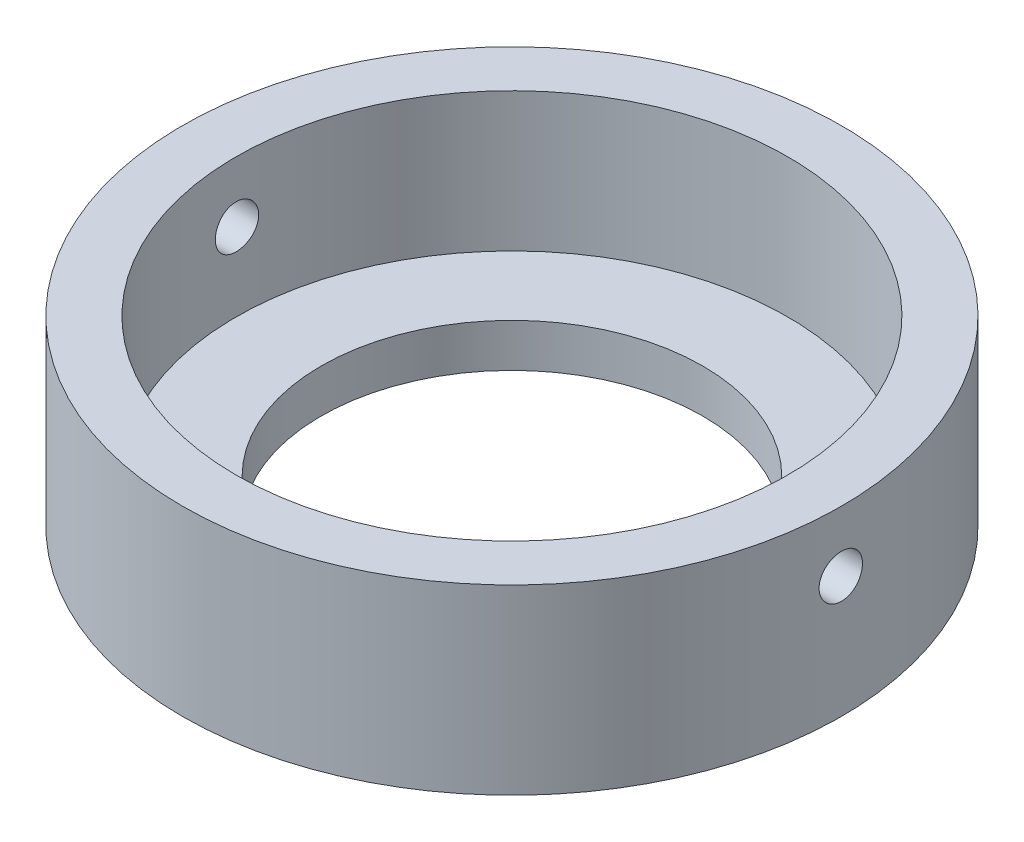
ISO-10303-21;
HEADER;
FILE_DESCRIPTION(('STEP AP214'),'2;1');
FILE_NAME('part.step','',(''),(''),'','','');
FILE_SCHEMA(('AUTOMOTIVE_DESIGN { 1 0 10303 214 1 1 1 1 }'));
ENDSEC;
DATA;
#1=APPLICATION_CONTEXT('core data for automotive mechanical design processes');
#2=APPLICATION_PROTOCOL_DEFINITION('international standard','automotive_design',2000,#1);
#3=PRODUCT_CONTEXT('',#1,'mechanical');
#4=PRODUCT('Part','Part','',(#3));
#5=PRODUCT_RELATED_PRODUCT_CATEGORY('part','',(#4));
#6=PRODUCT_DEFINITION_FORMATION('','',#4);
#7=PRODUCT_DEFINITION_CONTEXT('part definition',#1,'design');
#8=PRODUCT_DEFINITION('design','',#6,#7);
#9=PRODUCT_DEFINITION_SHAPE('','',#8);
#10=(LENGTH_UNIT() NAMED_UNIT(*) SI_UNIT(.MILLI.,.METRE.));
#11=(NAMED_UNIT(*) PLANE_ANGLE_UNIT() SI_UNIT($,.RADIAN.));
#12=(NAMED_UNIT(*) SI_UNIT($,.STERADIAN.) SOLID_ANGLE_UNIT());
#13=UNCERTAINTY_MEASURE_WITH_UNIT(LENGTH_MEASURE(1.E-05),#10,'distance_accuracy_value','');
#14=(GEOMETRIC_REPRESENTATION_CONTEXT(3) GLOBAL_UNCERTAINTY_ASSIGNED_CONTEXT((#13)) GLOBAL_UNIT_ASSIGNED_CONTEXT((#10,
#11,#12)) REPRESENTATION_CONTEXT('',''));
#15=CARTESIAN_POINT('',(0.,0.,0.));
#16=DIRECTION('',(0.,0.,1.));
#17=DIRECTION('',(1.,0.,0.));
#18=AXIS2_PLACEMENT_3D('',#15,#16,#17);
#19=CARTESIAN_POINT('',(0.,2.5,0.));
#20=DIRECTION('',(0.,-1.,0.));
#21=DIRECTION('',(0.,0.,-1.));
#22=AXIS2_PLACEMENT_3D('',#19,#20,#21);
#23=CYLINDRICAL_SURFACE('',#22,19.);
#24=CARTESIAN_POINT('',(18.9588369896468,7.,1.24999999999999));
#25=CARTESIAN_POINT('',(18.9588375396088,7.07013148410964,1.24999691698055));
#26=CARTESIAN_POINT('',(18.9592303148243,7.14031188548215,1.24407805299881));
#27=CARTESIAN_POINT('',(18.9607591328196,7.27873428538638,1.22055180266377));
#28=CARTESIAN_POINT('',(18.9618960375227,7.34697394019588,1.20293086147641));
#29=CARTESIAN_POINT('',(18.9647837839129,7.4794897783657,1.1565092682008));
#30=CARTESIAN_POINT('',(18.9665342981522,7.54376805421409,1.12771457801599));
#31=CARTESIAN_POINT('',(18.9704516079821,7.66656232997985,1.05977264730639));
#32=CARTESIAN_POINT('',(18.9726183091025,7.72507963302704,1.02062775541117));
#33=CARTESIAN_POINT('',(18.9771278975969,7.83480407260864,0.9330259586646));
#34=CARTESIAN_POINT('',(18.9794710371753,7.88600042957064,0.884555563854293));
#35=CARTESIAN_POINT('',(18.984067145466,7.97953738585654,0.779706632804727));
#36=CARTESIAN_POINT('',(18.9863201103897,8.02187761340709,0.723327764739887));
#37=CARTESIAN_POINT('',(18.9904842240195,8.09653392936496,0.604200969092946));
#38=CARTESIAN_POINT('',(18.9923950661852,8.1288410469995,0.541447407929066));
#39=CARTESIAN_POINT('',(18.9956569629665,8.18245663362515,0.411392049451877));
#40=CARTESIAN_POINT('',(18.9970080241015,8.20376523070846,0.344090305118453));
#41=CARTESIAN_POINT('',(18.998996383403,8.23474885133426,0.206953324972158));
#42=CARTESIAN_POINT('',(18.9996347217425,8.24444083010752,0.137121935206072));
#43=CARTESIAN_POINT('',(19.0001292164116,8.25196846233493,-0.00317924369410461));
#44=CARTESIAN_POINT('',(18.999985382355,8.24980426151516,-0.073649024971002));
#45=CARTESIAN_POINT('',(18.9989326057468,8.23369493743142,-0.213111746980413));
#46=CARTESIAN_POINT('',(18.9980248476562,8.21976805204224,-0.282106804548809));
#47=CARTESIAN_POINT('',(18.9955477714651,8.18055700174089,-0.416777761157239));
#48=CARTESIAN_POINT('',(18.9939784491166,8.15527276390538,-0.48245363888246));
#49=CARTESIAN_POINT('',(18.9903528796175,8.09404412894595,-0.608680412720544));
#50=CARTESIAN_POINT('',(18.98829625581,8.05809148028618,-0.669227295016875));
#51=CARTESIAN_POINT('',(18.9839274937888,7.97655258861317,-0.783433543890819));
#52=CARTESIAN_POINT('',(18.9816153523789,7.93096622508746,-0.837092824294812));
#53=CARTESIAN_POINT('',(18.9769905476197,7.83135095910624,-0.936107153052133));
#54=CARTESIAN_POINT('',(18.9746778915818,7.77730622437404,-0.981446274902408));
#55=CARTESIAN_POINT('',(18.970317163269,7.6623637752548,-1.06241044516599));
#56=CARTESIAN_POINT('',(18.9682690911121,7.60146605781396,-1.0980354892505));
#57=CARTESIAN_POINT('',(18.964668845539,7.4745360356885,-1.15855917855933));
#58=CARTESIAN_POINT('',(18.9631167041369,7.40850339986849,-1.18345713134759));
#59=CARTESIAN_POINT('',(18.9606844759929,7.27318270284996,-1.22180877024509));
#60=CARTESIAN_POINT('',(18.9598043804859,7.20389468412224,-1.23526260561433));
#61=CARTESIAN_POINT('',(18.9588171416418,7.06416903948202,-1.25032421791206));
#62=CARTESIAN_POINT('',(18.9587085531268,6.99373381081816,-1.25195414337159));
#63=CARTESIAN_POINT('',(18.9592727977804,6.85359097983464,-1.24337955784981));
#64=CARTESIAN_POINT('',(18.9599456264371,6.78388337331601,-1.23317511520025));
#65=CARTESIAN_POINT('',(18.9619955645894,6.64723729481512,-1.20123986779917));
#66=CARTESIAN_POINT('',(18.963372049623,6.58029642432118,-1.17951928244908));
#67=CARTESIAN_POINT('',(18.9666736573975,6.45100995516739,-1.12517867380962));
#68=CARTESIAN_POINT('',(18.9685987856506,6.38866440268511,-1.09255854101074));
#69=CARTESIAN_POINT('',(18.9727842462309,6.27023664657834,-1.01728828167363));
#70=CARTESIAN_POINT('',(18.9750450723162,6.21416388592539,-0.974623325732559));
#71=CARTESIAN_POINT('',(18.9796454413481,6.1099685822142,-0.880496081652914));
#72=CARTESIAN_POINT('',(18.9819849851459,6.06184612515927,-0.829033698359408));
#73=CARTESIAN_POINT('',(18.9864833988913,5.97484252619028,-0.71867704968889));
#74=CARTESIAN_POINT('',(18.9886419851557,5.93597572487409,-0.659771465254633));
#75=CARTESIAN_POINT('',(18.9925311801518,5.86868489103533,-0.536257375811505));
#76=CARTESIAN_POINT('',(18.9942617917539,5.84026078847091,-0.471648909056937));
#77=CARTESIAN_POINT('',(18.9970986926279,5.7946871087704,-0.338615587581912));
#78=CARTESIAN_POINT('',(18.9982054827766,5.77752848456221,-0.270193843255301));
#79=CARTESIAN_POINT('',(18.9996720348125,5.75494322959253,-0.131433046477445));
#80=CARTESIAN_POINT('',(19.000031804991,5.74951646861575,-0.0610940153154892));
#81=CARTESIAN_POINT('',(18.9999638037838,5.7505502787395,0.0793628308777347));
#82=CARTESIAN_POINT('',(18.9995375183576,5.75698842041219,0.149480812817942));
#83=CARTESIAN_POINT('',(18.9979482842031,5.78152273833978,0.287637803133685));
#84=CARTESIAN_POINT('',(18.996785334213,5.79961893456427,0.355676807947845));
#85=CARTESIAN_POINT('',(18.9938534516233,5.84695051494484,0.487747547886215));
#86=CARTESIAN_POINT('',(18.9920845266476,5.87618575896041,0.551779333413506));
#87=CARTESIAN_POINT('',(18.9881392048471,5.94496254986691,0.674028689025409));
#88=CARTESIAN_POINT('',(18.9859628180138,5.98450384404986,0.732246401624724));
#89=CARTESIAN_POINT('',(18.9814424191099,6.07285351594977,0.841329014255547));
#90=CARTESIAN_POINT('',(18.9790981168421,6.12167819073545,0.892180702337157));
#91=CARTESIAN_POINT('',(18.9745084582332,6.22718521529731,0.984984167349629));
#92=CARTESIAN_POINT('',(18.9722631262104,6.28386948225164,1.02693376647075));
#93=CARTESIAN_POINT('',(18.9681223184561,6.4035575904423,1.10077681645825));
#94=CARTESIAN_POINT('',(18.9662273109671,6.46656971844572,1.13265684810675));
#95=CARTESIAN_POINT('',(18.9630076611085,6.59701928150292,1.18534540776379));
#96=CARTESIAN_POINT('',(18.9616823527565,6.66445144259464,1.20616687006853));
#97=CARTESIAN_POINT('',(18.9600985946234,6.77691181079718,1.23075057711041));
#98=CARTESIAN_POINT('',(18.9596276152415,6.8212135446496,1.23795974025141));
#99=CARTESIAN_POINT('',(18.9589966371749,6.91033685337026,1.24758543358804));
#100=CARTESIAN_POINT('',(18.958836638005,6.95515842742738,1.25000197126071));
#101=CARTESIAN_POINT('',(18.9588369896468,7.,1.24999999999999));
#102=B_SPLINE_CURVE_WITH_KNOTS('',3,(#24,#25,#26,#27,#28,#29,#30,#31,#32,#33,#34,#35,#36,#37,
#38,#39,#40,#41,#42,#43,#44,#45,#46,#47,#48,#49,#50,#51,#52,#53,#54,#55,#56,#57,#58,#59,#60,#61,
#62,#63,#64,#65,#66,#67,#68,#69,#70,#71,#72,#73,#74,#75,#76,#77,#78,#79,#80,#81,#82,#83,#84,#85,
#86,#87,#88,#89,#90,#91,#92,#93,#94,#95,#96,#97,#98,#99,#100,#101),.UNSPECIFIED.,.T.,.F.,(4,2,2,
2,2,2,2,2,2,2,2,2,2,2,2,2,2,2,2,2,2,2,2,2,2,2,2,2,2,2,2,2,2,2,2,2,2,2,4),(0.,0.210230749240217,
0.420705440205018,0.631067983651483,0.841382833311276,1.05200423643321,1.26263447950241,
1.47345251198605,1.68426808916168,1.89477559074736,2.1052805049597,2.31545963219809,
2.52564010897453,2.73598357652074,2.94632967550407,3.15707431337854,3.36781904516507,
3.57857737853193,3.78933296303909,3.9996936583017,4.21005313894565,4.42022625868903,
4.63040149013909,4.84088897562352,5.0513787379314,5.26219253891799,5.47300492589643,
5.68364780605834,5.89428834822283,6.10453110361536,6.31477421914261,6.52501468968572,
6.73525000554354,6.94585785736152,7.15651717310201,7.36745605113516,7.57814766499504,
7.71256792183232,7.84698796895856),.UNSPECIFIED.);
#103=CARTESIAN_POINT('',(18.9588369896468,7.,1.24999999999999));
#104=VERTEX_POINT('',#103);
#105=EDGE_CURVE('E74',#104,#104,#102,.T.);
#106=ORIENTED_EDGE('',*,*,#105,.T.);
#107=EDGE_LOOP('',(#106));
#108=FACE_BOUND('',#107,.T.);
#109=CARTESIAN_POINT('',(-18.9705689319611,5.9420718434515,-1.05712555593429));
#110=CARTESIAN_POINT('',(-18.9677662861485,5.99629419312282,-1.10742192407926));
#111=CARTESIAN_POINT('',(-18.9649856856747,6.05424974257248,-1.15372164064828));
#112=CARTESIAN_POINT('',(-18.9597054284623,6.1762917727867,-1.23747134811881));
#113=CARTESIAN_POINT('',(-18.9572060217674,6.24038361781009,-1.27491349478546));
#114=CARTESIAN_POINT('',(-18.9523418330472,6.38380851707578,-1.34543206744556));
#115=CARTESIAN_POINT('',(-18.950060760891,6.46394945499014,-1.37688323319947));
#116=CARTESIAN_POINT('',(-18.946407466982,6.62831756667747,-1.42627496104311));
#117=CARTESIAN_POINT('',(-18.9450355416123,6.71254606340576,-1.44421111748194));
#118=CARTESIAN_POINT('',(-18.9433280446038,6.88486276047511,-1.46644259220615));
#119=CARTESIAN_POINT('',(-18.9430181798103,6.97299507061716,-1.4703996185725));
#120=CARTESIAN_POINT('',(-18.9435417507761,7.14869138735992,-1.46363798036328));
#121=CARTESIAN_POINT('',(-18.9443752213083,7.23625537659461,-1.45291886943484));
#122=CARTESIAN_POINT('',(-18.9471033256541,7.40906859753269,-1.4168988095983));
#123=CARTESIAN_POINT('',(-18.9490065603693,7.49429311993968,-1.39147962367509));
#124=CARTESIAN_POINT('',(-18.95366169911,7.65918467850104,-1.32655989389024));
#125=CARTESIAN_POINT('',(-18.9564135985352,7.73885174477815,-1.28705942635961));
#126=CARTESIAN_POINT('',(-18.9624083110717,7.8893248717607,-1.19546860954792));
#127=CARTESIAN_POINT('',(-18.9656451423692,7.96022194733279,-1.14352759475739));
#128=CARTESIAN_POINT('',(-18.972249627804,8.09194148228924,-1.02814006320633));
#129=CARTESIAN_POINT('',(-18.9756172615079,8.15276550748841,-0.964695337868967));
#130=CARTESIAN_POINT('',(-18.9819747960724,8.26061528303371,-0.830077588310768));
#131=CARTESIAN_POINT('',(-18.9849729686818,8.3079985472216,-0.759191593005473));
#132=CARTESIAN_POINT('',(-18.9903446765614,8.38964803874912,-0.610205994967871));
#133=CARTESIAN_POINT('',(-18.9927183687512,8.42391756230036,-0.532108211093196));
#134=CARTESIAN_POINT('',(-18.996473868298,8.47701625637805,-0.374138356340968));
#135=CARTESIAN_POINT('',(-18.9978901916986,8.49638666202069,-0.29444888578762));
#136=CARTESIAN_POINT('',(-18.9997065671621,8.5210966356126,-0.132915776110982));
#137=CARTESIAN_POINT('',(-19.0001068096528,8.52643883265223,-0.0510725435384695));
#138=CARTESIAN_POINT('',(-18.9998474013877,8.52294485683122,0.110102157462776));
#139=CARTESIAN_POINT('',(-18.9992158853331,8.5144850551604,0.189442127310822));
#140=CARTESIAN_POINT('',(-18.9970177045635,8.48439908761366,0.34556533288149));
#141=CARTESIAN_POINT('',(-18.9954510646597,8.46277327106536,0.422348636381924));
#142=CARTESIAN_POINT('',(-18.9915558362146,8.4070880838567,0.571284456042974));
#143=CARTESIAN_POINT('',(-18.989226806353,8.3730215103632,0.643434261031799));
#144=CARTESIAN_POINT('',(-18.9840594564712,8.29357358859691,0.781181618972696));
#145=CARTESIAN_POINT('',(-18.9812210803858,8.24819099452064,0.846778449380168));
#146=CARTESIAN_POINT('',(-18.9752538090447,8.14615206413419,0.971467135948675));
#147=CARTESIAN_POINT('',(-18.9721191877792,8.08922754279029,1.03033907834171));
#148=CARTESIAN_POINT('',(-18.9659599443625,7.96660930180564,1.13810547232384));
#149=CARTESIAN_POINT('',(-18.9629353415514,7.90091404976447,1.18699817658157));
#150=CARTESIAN_POINT('',(-18.9572030208753,7.75999572016471,1.27534008311509));
#151=CARTESIAN_POINT('',(-18.9545113011066,7.6845089103943,1.31436973826795));
#152=CARTESIAN_POINT('',(-18.9498714881824,7.52817913579579,1.37965427223562));
#153=CARTESIAN_POINT('',(-18.9479235166329,7.44733529760507,1.40590706217253));
#154=CARTESIAN_POINT('',(-18.9449321895507,7.27993299630997,1.44566918938653));
#155=CARTESIAN_POINT('',(-18.9439183365141,7.19327536668519,1.45876403358614));
#156=CARTESIAN_POINT('',(-18.9430120165431,7.01897794862135,1.47048645574347));
#157=CARTESIAN_POINT('',(-18.9431196667616,6.93133805852998,1.46911252228368));
#158=CARTESIAN_POINT('',(-18.9444542089947,6.75625845094541,1.45180271502945));
#159=CARTESIAN_POINT('',(-18.9456968913864,6.66883905256669,1.43566139457929));
#160=CARTESIAN_POINT('',(-18.9491824608535,6.49797698615774,1.38889501058114));
#161=CARTESIAN_POINT('',(-18.9514253663719,6.41453439148662,1.35826967996391));
#162=CARTESIAN_POINT('',(-18.9566384198646,6.25451050542352,1.28345325843521));
#163=CARTESIAN_POINT('',(-18.9596047529666,6.17789601076512,1.23933303004397));
#164=CARTESIAN_POINT('',(-18.9659227927169,6.03341626197766,1.13855687277488));
#165=CARTESIAN_POINT('',(-18.9692744583861,5.965550079111,1.0819022763071));
#166=CARTESIAN_POINT('',(-18.9758756792714,5.84234017881964,0.959073911477655));
#167=CARTESIAN_POINT('',(-18.9791257254322,5.78673055711979,0.893167156626319));
#168=CARTESIAN_POINT('',(-18.9852173322174,5.68787682809751,0.752632409632592));
#169=CARTESIAN_POINT('',(-18.9880589881408,5.64462983358516,0.678006459531128));
#170=CARTESIAN_POINT('',(-18.9928892177543,5.57345086929805,0.525148654074515));
#171=CARTESIAN_POINT('',(-18.9949057529763,5.54500602412726,0.447156489046599));
#172=CARTESIAN_POINT('',(-18.9979938483914,5.5020872555964,0.28740452763545));
#173=CARTESIAN_POINT('',(-18.9990656431229,5.48760986463247,0.205645671666527));
#174=CARTESIAN_POINT('',(-19.0001172631899,5.47340707144413,0.0435641623958573));
#175=CARTESIAN_POINT('',(-19.0001317840648,5.47321294672758,-0.0367175157280901));
#176=CARTESIAN_POINT('',(-18.9991546434706,5.48640603786591,-0.196157983436856));
#177=CARTESIAN_POINT('',(-18.9981629176488,5.49979412234596,-0.275316700876486));
#178=CARTESIAN_POINT('',(-18.995299006671,5.53949488325817,-0.429560107299692));
#179=CARTESIAN_POINT('',(-18.9934345040151,5.5656948727547,-0.504674090640115));
#180=CARTESIAN_POINT('',(-18.9890332129628,5.63007362317762,-0.649512260647918));
#181=CARTESIAN_POINT('',(-18.9864968344493,5.66824508342114,-0.719239700031817));
#182=CARTESIAN_POINT('',(-18.9817033777832,5.74450175640642,-0.835120297419386));
#183=CARTESIAN_POINT('',(-18.9795331116262,5.78025910019073,-0.882830448582407));
#184=CARTESIAN_POINT('',(-18.9750934320603,5.85723021485121,-0.973597285307051));
#185=CARTESIAN_POINT('',(-18.9728240454795,5.89844251533769,-1.01665521921831));
#186=CARTESIAN_POINT('',(-18.9705689319611,5.9420718434515,-1.05712555593429));
#187=B_SPLINE_CURVE_WITH_KNOTS('',3,(#109,#110,#111,#112,#113,#114,#115,#116,#117,#118,#119,
#120,#121,#122,#123,#124,#125,#126,#127,#128,#129,#130,#131,#132,#133,#134,#135,#136,#137,#138,
#139,#140,#141,#142,#143,#144,#145,#146,#147,#148,#149,#150,#151,#152,#153,#154,#155,#156,#157,
#158,#159,#160,#161,#162,#163,#164,#165,#166,#167,#168,#169,#170,#171,#172,#173,#174,#175,#176,
#177,#178,#179,#180,#181,#182,#183,#184,#185,#186),.UNSPECIFIED.,.T.,.F.,(4,2,2,2,2,2,2,2,2,2,2,
2,2,2,2,2,2,2,2,2,2,2,2,2,2,2,2,2,2,2,2,2,2,2,2,2,2,2,4),(0.,0.221867608989586,
0.443930973751528,0.70109091406853,0.958334647695458,1.22176252914999,1.48519842254936,
1.75078327546906,2.01636668874321,2.2789091377999,2.54141073731358,2.79608102928326,
3.05068726634647,3.29553931858209,3.54034547870519,3.77858681841761,4.01682183726082,
4.2551950064319,4.49359443018072,4.73834643242589,4.98314125323631,5.23705346500419,
5.49100717471228,5.7527311841889,6.01448253378954,6.27993172262784,6.5453858062485,
6.80946923314762,7.07352460131268,7.33111519039006,7.58864557206358,7.83653183040895,
8.08435653188841,8.32404481509757,8.5637484280956,8.80138065485581,9.03886824482772,
9.21743924762482,9.39596221406046),.UNSPECIFIED.);
#188=CARTESIAN_POINT('',(-18.9705689319611,5.9420718434515,-1.05712555593429));
#189=VERTEX_POINT('',#188);
#190=EDGE_CURVE('E10',#189,#189,#187,.T.);
#191=ORIENTED_EDGE('',*,*,#190,.T.);
#192=EDGE_LOOP('',(#191));
#193=FACE_BOUND('',#192,.T.);
#194=CARTESIAN_POINT('',(0.,0.,0.));
#195=DIRECTION('',(0.,1.,0.));
#196=DIRECTION('',(0.,0.,1.));
#197=AXIS2_PLACEMENT_3D('',#194,#195,#196);
#198=CIRCLE('',#197,19.);
#199=CARTESIAN_POINT('',(0.,0.,19.));
#200=VERTEX_POINT('',#199);
#201=EDGE_CURVE('E65',#200,#200,#198,.T.);
#202=ORIENTED_EDGE('',*,*,#201,.T.);
#203=EDGE_LOOP('',(#202));
#204=FACE_BOUND('',#203,.T.);
#205=CARTESIAN_POINT('',(0.,10.5,0.));
#206=DIRECTION('',(0.,1.,0.));
#207=DIRECTION('',(0.,0.,1.));
#208=AXIS2_PLACEMENT_3D('',#205,#206,#207);
#209=CIRCLE('',#208,19.);
#210=CARTESIAN_POINT('',(0.,10.5,19.));
#211=VERTEX_POINT('',#210);
#212=EDGE_CURVE('E124',#211,#211,#209,.T.);
#213=ORIENTED_EDGE('',*,*,#212,.F.);
#214=EDGE_LOOP('',(#213));
#215=FACE_BOUND('',#214,.T.);
#216=ADVANCED_FACE('F47',(#108,#193,#204,#215),#23,.T.);
#217=CARTESIAN_POINT('',(0.,0.,0.));
#218=DIRECTION('',(0.,1.,0.));
#219=DIRECTION('',(0.,0.,1.));
#220=AXIS2_PLACEMENT_3D('',#217,#218,#219);
#221=PLANE('',#220);
#222=CARTESIAN_POINT('',(0.,0.,0.));
#223=DIRECTION('',(0.,-1.,0.));
#224=DIRECTION('',(0.,0.,-1.));
#225=AXIS2_PLACEMENT_3D('',#222,#223,#224);
#226=CIRCLE('',#225,11.);
#227=CARTESIAN_POINT('',(0.,0.,-11.));
#228=VERTEX_POINT('',#227);
#229=EDGE_CURVE('E120',#228,#228,#226,.T.);
#230=ORIENTED_EDGE('',*,*,#229,.F.);
#231=EDGE_LOOP('',(#230));
#232=FACE_BOUND('',#231,.T.);
#233=ORIENTED_EDGE('',*,*,#201,.F.);
#234=EDGE_LOOP('',(#233));
#235=FACE_BOUND('',#234,.T.);
#236=ADVANCED_FACE('F107',(#232,#235),#221,.F.);
#237=CARTESIAN_POINT('',(0.,10.5,0.));
#238=DIRECTION('',(0.,1.,0.));
#239=DIRECTION('',(0.,0.,1.));
#240=AXIS2_PLACEMENT_3D('',#237,#238,#239);
#241=PLANE('',#240);
#242=ORIENTED_EDGE('',*,*,#212,.T.);
#243=EDGE_LOOP('',(#242));
#244=FACE_BOUND('',#243,.T.);
#245=CARTESIAN_POINT('',(0.,10.5,0.));
#246=DIRECTION('',(0.,1.,0.));
#247=DIRECTION('',(0.,0.,1.));
#248=AXIS2_PLACEMENT_3D('',#245,#246,#247);
#249=CIRCLE('',#248,15.9);
#250=CARTESIAN_POINT('',(0.,10.5,15.9));
#251=VERTEX_POINT('',#250);
#252=EDGE_CURVE('E127',#251,#251,#249,.T.);
#253=ORIENTED_EDGE('',*,*,#252,.F.);
#254=EDGE_LOOP('',(#253));
#255=FACE_BOUND('',#254,.T.);
#256=ADVANCED_FACE('F102',(#244,#255),#241,.T.);
#257=CARTESIAN_POINT('',(0.,10.5,0.));
#258=DIRECTION('',(0.,-1.,0.));
#259=DIRECTION('',(0.,0.,-1.));
#260=AXIS2_PLACEMENT_3D('',#257,#258,#259);
#261=CYLINDRICAL_SURFACE('',#260,15.9);
#262=CARTESIAN_POINT('',(15.850788623914,7.,1.24999999999999));
#263=CARTESIAN_POINT('',(15.8507892775509,7.07009654904745,1.24999693199842));
#264=CARTESIAN_POINT('',(15.851258607696,7.14024116123575,1.24408393783195));
#265=CARTESIAN_POINT('',(15.8530852592729,7.27859056865228,1.2205823682363));
#266=CARTESIAN_POINT('',(15.8544435937414,7.34679305816501,1.20298047275567));
#267=CARTESIAN_POINT('',(15.8578934584565,7.47923437030208,1.15661243518489));
#268=CARTESIAN_POINT('',(15.8599845801773,7.54347537801721,1.12785251269174));
#269=CARTESIAN_POINT('',(15.8646638891021,7.66620247005758,1.05999563188118));
#270=CARTESIAN_POINT('',(15.8672519681117,7.724689802852,1.02090092289051));
#271=CARTESIAN_POINT('',(15.8726402705951,7.83439946949378,0.933386839971728));
#272=CARTESIAN_POINT('',(15.8754409155074,7.88560676039682,0.884948632141071));
#273=CARTESIAN_POINT('',(15.8809349147649,7.97917362066215,0.780162214149982));
#274=CARTESIAN_POINT('',(15.8836282644725,8.02153280793249,0.723813662568953));
#275=CARTESIAN_POINT('',(15.888608130452,8.09625036103549,0.604717276829065));
#276=CARTESIAN_POINT('',(15.8908941200573,8.12859581959447,0.541961321128374));
#277=CARTESIAN_POINT('',(15.8947971729871,8.18228517595658,0.411888260517851));
#278=CARTESIAN_POINT('',(15.8964142468742,8.20362924747982,0.344571227649828));
#279=CARTESIAN_POINT('',(15.8987943282346,8.23466694565363,0.207435743414749));
#280=CARTESIAN_POINT('',(15.8995591091811,8.24438476761767,0.137622799407208));
#281=CARTESIAN_POINT('',(15.900154436508,8.25196889078762,-0.00264720097783777));
#282=CARTESIAN_POINT('',(15.899984998544,8.24983539059707,-0.0731042465417853));
#283=CARTESIAN_POINT('',(15.8987324462377,8.23379725936984,-0.212498420542563));
#284=CARTESIAN_POINT('',(15.8976513515716,8.21991864810812,-0.281438563380013));
#285=CARTESIAN_POINT('',(15.8946994360907,8.18082469617761,-0.416007774964324));
#286=CARTESIAN_POINT('',(15.8928286084663,8.15560925775603,-0.481636815155484));
#287=CARTESIAN_POINT('',(15.8885042628265,8.09452830848651,-0.607803839070999));
#288=CARTESIAN_POINT('',(15.8860501059308,8.05865110969209,-0.668336141553071));
#289=CARTESIAN_POINT('',(15.8808349982898,7.97727355057846,-0.782529385540704));
#290=CARTESIAN_POINT('',(15.8780740420176,7.93177301688168,-0.836190203219086));
#291=CARTESIAN_POINT('',(15.8725469162686,7.8322936549504,-0.935269311613456));
#292=CARTESIAN_POINT('',(15.8697807528948,7.77829222360331,-0.980664911319715));
#293=CARTESIAN_POINT('',(15.8645625102126,7.66342284395011,-1.06174975372496));
#294=CARTESIAN_POINT('',(15.8621104311237,7.60255489084523,-1.09743898964047));
#295=CARTESIAN_POINT('',(15.857797474707,7.47566473121945,-1.15809696587496));
#296=CARTESIAN_POINT('',(15.8559366592466,7.4096419862225,-1.1830645844248));
#297=CARTESIAN_POINT('',(15.8530180557572,7.27432373705571,-1.2215540733645));
#298=CARTESIAN_POINT('',(15.8519602527251,7.20502829405704,-1.23507615759759));
#299=CARTESIAN_POINT('',(15.8507698129154,7.0653300901437,-1.25026212504303));
#300=CARTESIAN_POINT('',(15.8506347093907,6.99493078634763,-1.25195762573284));
#301=CARTESIAN_POINT('',(15.8512984516509,6.85484891331627,-1.24352506532475));
#302=CARTESIAN_POINT('',(15.8520972896962,6.78516633814627,-1.2333971022079));
#303=CARTESIAN_POINT('',(15.854536653126,6.64858638004995,-1.20163144454074));
#304=CARTESIAN_POINT('',(15.8561761029585,6.58168555587587,-1.1800084564282));
#305=CARTESIAN_POINT('',(15.8601110630625,6.45246166480059,-1.12588148211574));
#306=CARTESIAN_POINT('',(15.8624065827196,6.39013866340441,-1.09337734025209));
#307=CARTESIAN_POINT('',(15.8674010099352,6.27169471572673,-1.018330527039));
#308=CARTESIAN_POINT('',(15.8701007608834,6.21558717366725,-0.975766757208865));
#309=CARTESIAN_POINT('',(15.8755965726498,6.11130219377497,-0.881839447352911));
#310=CARTESIAN_POINT('',(15.8783926349443,6.06312487756407,-0.830475772392022));
#311=CARTESIAN_POINT('',(15.8837733327633,5.97596028632173,-0.720270186447688));
#312=CARTESIAN_POINT('',(15.8863574879341,5.93699353322656,-0.661412017440934));
#313=CARTESIAN_POINT('',(15.8910162898413,5.86949690201339,-0.537969402003478));
#314=CARTESIAN_POINT('',(15.8930909411855,5.84096692950606,-0.473385007366819));
#315=CARTESIAN_POINT('',(15.896494750056,5.79518907960065,-0.340397268952151));
#316=CARTESIAN_POINT('',(15.8978247508161,5.77792843724515,-0.271998341654826));
#317=CARTESIAN_POINT('',(15.8995928136544,5.75513747992789,-0.13326235344516));
#318=CARTESIAN_POINT('',(15.9000308905742,5.7496069697764,-0.0629253248026082));
#319=CARTESIAN_POINT('',(15.8999657756072,5.75043543649651,0.0774877710721057));
#320=CARTESIAN_POINT('',(15.899465118292,5.75676239830868,0.147564030605472));
#321=CARTESIAN_POINT('',(15.8975838139075,5.78105954223302,0.285655548271497));
#322=CARTESIAN_POINT('',(15.8962031655402,5.79902974151915,0.353670803363985));
#323=CARTESIAN_POINT('',(15.8927168534933,5.84609531980036,0.485712317249712));
#324=CARTESIAN_POINT('',(15.8906112208107,5.87519022316084,0.549738746448353));
#325=CARTESIAN_POINT('',(15.8859107200105,5.94367551842315,0.672003184878835));
#326=CARTESIAN_POINT('',(15.8833158608654,5.98306572151154,0.730241300239992));
#327=CARTESIAN_POINT('',(15.8779199769069,6.07114345530807,0.839439592740208));
#328=CARTESIAN_POINT('',(15.8751184398795,6.11985459673281,0.890380700288511));
#329=CARTESIAN_POINT('',(15.8696292832031,6.22515053966098,0.983383426108168));
#330=CARTESIAN_POINT('',(15.8669416913775,6.28173724994798,1.02544288551528));
#331=CARTESIAN_POINT('',(15.8619797086955,6.4012763364694,1.09953871623095));
#332=CARTESIAN_POINT('',(15.8597060329381,6.46423944226664,1.13155780902969));
#333=CARTESIAN_POINT('',(15.8558381242139,6.5946223224294,1.18452915846));
#334=CARTESIAN_POINT('',(15.8542431068227,6.66203684690875,1.20549419861606));
#335=CARTESIAN_POINT('',(15.8523252895834,6.77487741386696,1.23039514241354));
#336=CARTESIAN_POINT('',(15.8517516702379,6.81957674585621,1.23773725860678));
#337=CARTESIAN_POINT('',(15.8509831268513,6.909510708407,1.24754067204049));
#338=CARTESIAN_POINT('',(15.8507882019229,6.95474533771415,1.25000198071625));
#339=CARTESIAN_POINT('',(15.850788623914,7.,1.24999999999999));
#340=B_SPLINE_CURVE_WITH_KNOTS('',3,(#262,#263,#264,#265,#266,#267,#268,#269,#270,#271,#272,
#273,#274,#275,#276,#277,#278,#279,#280,#281,#282,#283,#284,#285,#286,#287,#288,#289,#290,#291,
#292,#293,#294,#295,#296,#297,#298,#299,#300,#301,#302,#303,#304,#305,#306,#307,#308,#309,#310,
#311,#312,#313,#314,#315,#316,#317,#318,#319,#320,#321,#322,#323,#324,#325,#326,#327,#328,#329,
#330,#331,#332,#333,#334,#335,#336,#337,#338,#339),.UNSPECIFIED.,.T.,.F.,(4,2,2,2,2,2,2,2,2,2,2,
2,2,2,2,2,2,2,2,2,2,2,2,2,2,2,2,2,2,2,2,2,2,2,2,2,2,2,4),(0.,0.210124420478212,
0.420488699427558,0.630735887282972,0.840937353263645,1.0515670404181,1.26220582141706,
1.47311498725351,1.68402082257472,1.89448697535316,2.10494960116682,2.3149471911246,
2.52494659183972,2.73517705884202,2.94541131375684,3.15621430990459,3.36701745337563,
3.57784264714652,3.78866390186688,3.99892132512942,4.20917700600082,4.41916433627672,
4.62915467071999,4.83958939748271,5.05002735127644,5.26092985020116,5.47183044169515,
5.68249172621114,5.8931495052899,6.10323932967322,6.31332946394328,6.52341061685416,
6.73348791719512,6.94410457923341,7.15477237713276,7.36580074939184,7.57658453838491,
7.71224217196359,7.84789948770841),.UNSPECIFIED.);
#341=CARTESIAN_POINT('',(15.850788623914,7.,1.24999999999999));
#342=VERTEX_POINT('',#341);
#343=EDGE_CURVE('E51',#342,#342,#340,.T.);
#344=ORIENTED_EDGE('',*,*,#343,.F.);
#345=EDGE_LOOP('',(#344));
#346=FACE_BOUND('',#345,.T.);
#347=CARTESIAN_POINT('',(-15.850788623914,7.,1.24999999999999));
#348=CARTESIAN_POINT('',(-15.8507892775509,6.92990345095255,1.24999693199843));
#349=CARTESIAN_POINT('',(-15.851258607696,6.85975883876425,1.24408393783196));
#350=CARTESIAN_POINT('',(-15.8530852592729,6.72140943134772,1.22058236823631));
#351=CARTESIAN_POINT('',(-15.8544435937414,6.653206941835,1.20298047275568));
#352=CARTESIAN_POINT('',(-15.8578934584565,6.52076562969793,1.15661243518489));
#353=CARTESIAN_POINT('',(-15.8599845801773,6.45652462198279,1.12785251269174));
#354=CARTESIAN_POINT('',(-15.8646638891021,6.33379752994243,1.05999563188119));
#355=CARTESIAN_POINT('',(-15.8672519681117,6.275310197148,1.02090092289051));
#356=CARTESIAN_POINT('',(-15.8726402705951,6.16560053050622,0.933386839971734));
#357=CARTESIAN_POINT('',(-15.8754409155074,6.11439323960318,0.884948632141078));
#358=CARTESIAN_POINT('',(-15.8809349147649,6.02082637933785,0.780162214149988));
#359=CARTESIAN_POINT('',(-15.8836282644725,5.97846719206752,0.723813662568959));
#360=CARTESIAN_POINT('',(-15.888608130452,5.90374963896451,0.604717276829071));
#361=CARTESIAN_POINT('',(-15.8908941200573,5.87140418040553,0.54196132112838));
#362=CARTESIAN_POINT('',(-15.8947971729871,5.81771482404342,0.411888260517858));
#363=CARTESIAN_POINT('',(-15.8964142468742,5.79637075252019,0.344571227649834));
#364=CARTESIAN_POINT('',(-15.8987943282346,5.76533305434638,0.207435743414755));
#365=CARTESIAN_POINT('',(-15.8995591091811,5.75561523238234,0.137622799407215));
#366=CARTESIAN_POINT('',(-15.900154436508,5.74803110921238,-0.00264720097783155));
#367=CARTESIAN_POINT('',(-15.899984998544,5.75016460940293,-0.0731042465417793));
#368=CARTESIAN_POINT('',(-15.8987324462377,5.76620274063016,-0.212498420542557));
#369=CARTESIAN_POINT('',(-15.8976513515716,5.78008135189188,-0.281438563380007));
#370=CARTESIAN_POINT('',(-15.8946994360907,5.8191753038224,-0.416007774964318));
#371=CARTESIAN_POINT('',(-15.8928286084663,5.84439074224397,-0.481636815155478));
#372=CARTESIAN_POINT('',(-15.8885042628265,5.90547169151349,-0.607803839070993));
#373=CARTESIAN_POINT('',(-15.8860501059308,5.94134889030791,-0.668336141553065));
#374=CARTESIAN_POINT('',(-15.8808349982898,6.02272644942154,-0.782529385540697));
#375=CARTESIAN_POINT('',(-15.8780740420176,6.06822698311832,-0.83619020321908));
#376=CARTESIAN_POINT('',(-15.8725469162686,6.16770634504961,-0.93526931161345));
#377=CARTESIAN_POINT('',(-15.8697807528948,6.22170777639669,-0.980664911319709));
#378=CARTESIAN_POINT('',(-15.8645625102126,6.3365771560499,-1.06174975372495));
#379=CARTESIAN_POINT('',(-15.8621104311237,6.39744510915477,-1.09743898964046));
#380=CARTESIAN_POINT('',(-15.857797474707,6.52433526878055,-1.15809696587495));
#381=CARTESIAN_POINT('',(-15.8559366592466,6.5903580137775,-1.1830645844248));
#382=CARTESIAN_POINT('',(-15.8530180557572,6.72567626294429,-1.2215540733645));
#383=CARTESIAN_POINT('',(-15.8519602527251,6.79497170594296,-1.23507615759759));
#384=CARTESIAN_POINT('',(-15.8507698129154,6.9346699098563,-1.25026212504303));
#385=CARTESIAN_POINT('',(-15.8506347093907,7.00506921365237,-1.25195762573283));
#386=CARTESIAN_POINT('',(-15.8512984516509,7.14515108668373,-1.24352506532474));
#387=CARTESIAN_POINT('',(-15.8520972896962,7.21483366185373,-1.2333971022079));
#388=CARTESIAN_POINT('',(-15.854536653126,7.35141361995005,-1.20163144454074));
#389=CARTESIAN_POINT('',(-15.8561761029585,7.41831444412413,-1.1800084564282));
#390=CARTESIAN_POINT('',(-15.8601110630625,7.54753833519941,-1.12588148211573));
#391=CARTESIAN_POINT('',(-15.8624065827196,7.60986133659559,-1.09337734025208));
#392=CARTESIAN_POINT('',(-15.8674010099352,7.72830528427327,-1.018330527039));
#393=CARTESIAN_POINT('',(-15.8701007608834,7.78441282633275,-0.97576675720886));
#394=CARTESIAN_POINT('',(-15.8755965726498,7.88869780622503,-0.881839447352905));
#395=CARTESIAN_POINT('',(-15.8783926349443,7.93687512243594,-0.830475772392015));
#396=CARTESIAN_POINT('',(-15.8837733327633,8.02403971367828,-0.720270186447682));
#397=CARTESIAN_POINT('',(-15.8863574879341,8.06300646677344,-0.661412017440927));
#398=CARTESIAN_POINT('',(-15.8910162898413,8.13050309798661,-0.537969402003472));
#399=CARTESIAN_POINT('',(-15.8930909411855,8.15903307049395,-0.473385007366814));
#400=CARTESIAN_POINT('',(-15.896494750056,8.20481092039935,-0.340397268952145));
#401=CARTESIAN_POINT('',(-15.8978247508161,8.22207156275486,-0.271998341654821));
#402=CARTESIAN_POINT('',(-15.8995928136544,8.24486252007212,-0.133262353445154));
#403=CARTESIAN_POINT('',(-15.9000308905742,8.2503930302236,-0.0629253248026031));
#404=CARTESIAN_POINT('',(-15.8999657756072,8.24956456350349,0.0774877710721109));
#405=CARTESIAN_POINT('',(-15.899465118292,8.24323760169132,0.147564030605477));
#406=CARTESIAN_POINT('',(-15.8975838139075,8.21894045776698,0.285655548271502));
#407=CARTESIAN_POINT('',(-15.8962031655402,8.20097025848085,0.35367080336399));
#408=CARTESIAN_POINT('',(-15.8927168534933,8.15390468019964,0.485712317249717));
#409=CARTESIAN_POINT('',(-15.8906112208107,8.12480977683916,0.549738746448358));
#410=CARTESIAN_POINT('',(-15.8859107200105,8.05632448157685,0.67200318487884));
#411=CARTESIAN_POINT('',(-15.8833158608654,8.01693427848847,0.730241300239998));
#412=CARTESIAN_POINT('',(-15.8779199769069,7.92885654469194,0.839439592740212));
#413=CARTESIAN_POINT('',(-15.8751184398795,7.8801454032672,0.890380700288515));
#414=CARTESIAN_POINT('',(-15.8696292832031,7.77484946033902,0.983383426108173));
#415=CARTESIAN_POINT('',(-15.8669416913775,7.71826275005203,1.02544288551528));
#416=CARTESIAN_POINT('',(-15.8619797086955,7.5987236635306,1.09953871623096));
#417=CARTESIAN_POINT('',(-15.8597060329381,7.53576055773336,1.1315578090297));
#418=CARTESIAN_POINT('',(-15.8558381242139,7.4053776775706,1.18452915846));
#419=CARTESIAN_POINT('',(-15.8542431068227,7.33796315309126,1.20549419861607));
#420=CARTESIAN_POINT('',(-15.8523252895834,7.22512258613304,1.23039514241354));
#421=CARTESIAN_POINT('',(-15.8517516702379,7.18042325414379,1.23773725860678));
#422=CARTESIAN_POINT('',(-15.8509831268513,7.090489291593,1.2475406720405));
#423=CARTESIAN_POINT('',(-15.8507882019229,7.04525466228585,1.25000198071626));
#424=CARTESIAN_POINT('',(-15.850788623914,7.,1.24999999999999));
#425=B_SPLINE_CURVE_WITH_KNOTS('',3,(#347,#348,#349,#350,#351,#352,#353,#354,#355,#356,#357,
#358,#359,#360,#361,#362,#363,#364,#365,#366,#367,#368,#369,#370,#371,#372,#373,#374,#375,#376,
#377,#378,#379,#380,#381,#382,#383,#384,#385,#386,#387,#388,#389,#390,#391,#392,#393,#394,#395,
#396,#397,#398,#399,#400,#401,#402,#403,#404,#405,#406,#407,#408,#409,#410,#411,#412,#413,#414,
#415,#416,#417,#418,#419,#420,#421,#422,#423,#424),.UNSPECIFIED.,.T.,.F.,(4,2,2,2,2,2,2,2,2,2,2,
2,2,2,2,2,2,2,2,2,2,2,2,2,2,2,2,2,2,2,2,2,2,2,2,2,2,2,4),(0.,0.210124420478212,
0.420488699427558,0.630735887282972,0.840937353263645,1.0515670404181,1.26220582141706,
1.47311498725351,1.68402082257471,1.89448697535316,2.10494960116682,2.3149471911246,
2.52494659183971,2.73517705884202,2.94541131375683,3.15621430990459,3.36701745337563,
3.57784264714652,3.78866390186688,3.99892132512942,4.20917700600082,4.41916433627672,
4.62915467071999,4.8395893974827,5.05002735127644,5.26092985020116,5.47183044169515,
5.68249172621114,5.8931495052899,6.10323932967321,6.31332946394328,6.52341061685416,
6.73348791719512,6.9441045792334,7.15477237713275,7.36580074939184,7.57658453838491,
7.71224217196359,7.84789948770841),.UNSPECIFIED.);
#426=CARTESIAN_POINT('',(-15.850788623914,7.,1.24999999999999));
#427=VERTEX_POINT('',#426);
#428=EDGE_CURVE('E91',#427,#427,#425,.T.);
#429=ORIENTED_EDGE('',*,*,#428,.F.);
#430=EDGE_LOOP('',(#429));
#431=FACE_BOUND('',#430,.T.);
#432=ORIENTED_EDGE('',*,*,#252,.T.);
#433=EDGE_LOOP('',(#432));
#434=FACE_BOUND('',#433,.T.);
#435=CARTESIAN_POINT('',(0.,2.5,0.));
#436=DIRECTION('',(0.,1.,0.));
#437=DIRECTION('',(0.,0.,1.));
#438=AXIS2_PLACEMENT_3D('',#435,#436,#437);
#439=CIRCLE('',#438,15.9);
#440=CARTESIAN_POINT('',(0.,2.5,15.9));
#441=VERTEX_POINT('',#440);
#442=EDGE_CURVE('E60',#441,#441,#439,.F.);
#443=ORIENTED_EDGE('',*,*,#442,.T.);
#444=EDGE_LOOP('',(#443));
#445=FACE_BOUND('',#444,.T.);
#446=ADVANCED_FACE('F97',(#346,#431,#434,#445),#261,.F.);
#447=CARTESIAN_POINT('',(0.,2.5,0.));
#448=DIRECTION('',(0.,1.,0.));
#449=DIRECTION('',(0.,0.,1.));
#450=AXIS2_PLACEMENT_3D('',#447,#448,#449);
#451=PLANE('',#450);
#452=CARTESIAN_POINT('',(0.,2.5,0.));
#453=DIRECTION('',(0.,1.,0.));
#454=DIRECTION('',(0.,0.,1.));
#455=AXIS2_PLACEMENT_3D('',#452,#453,#454);
#456=CIRCLE('',#455,11.);
#457=CARTESIAN_POINT('',(0.,2.5,11.));
#458=VERTEX_POINT('',#457);
#459=EDGE_CURVE('E73',#458,#458,#456,.T.);
#460=ORIENTED_EDGE('',*,*,#459,.F.);
#461=EDGE_LOOP('',(#460));
#462=FACE_BOUND('',#461,.T.);
#463=ORIENTED_EDGE('',*,*,#442,.F.);
#464=EDGE_LOOP('',(#463));
#465=FACE_BOUND('',#464,.T.);
#466=ADVANCED_FACE('F101',(#462,#465),#451,.T.);
#467=CARTESIAN_POINT('',(0.,6.,0.));
#468=DIRECTION('',(0.,-1.,0.));
#469=DIRECTION('',(0.,0.,-1.));
#470=AXIS2_PLACEMENT_3D('',#467,#468,#469);
#471=CYLINDRICAL_SURFACE('',#470,11.);
#472=ORIENTED_EDGE('',*,*,#459,.T.);
#473=EDGE_LOOP('',(#472));
#474=FACE_BOUND('',#473,.T.);
#475=ORIENTED_EDGE('',*,*,#229,.T.);
#476=EDGE_LOOP('',(#475));
#477=FACE_BOUND('',#476,.T.);
#478=ADVANCED_FACE('F82',(#474,#477),#471,.F.);
#479=CARTESIAN_POINT('',(-19.,7.,0.));
#480=DIRECTION('',(-1.,0.,0.));
#481=DIRECTION('',(0.,0.,1.));
#482=AXIS2_PLACEMENT_3D('',#479,#480,#481);
#483=CONICAL_SURFACE('',#482,1.525,0.785398163397442);
#484=CARTESIAN_POINT('',(-18.725,7.,0.));
#485=DIRECTION('',(-1.,0.,0.));
#486=DIRECTION('',(0.,0.,1.));
#487=AXIS2_PLACEMENT_3D('',#484,#485,#486);
#488=CIRCLE('',#487,1.25);
#489=CARTESIAN_POINT('',(-18.725,7.,1.25));
#490=VERTEX_POINT('',#489);
#491=EDGE_CURVE('E96',#490,#490,#488,.T.);
#492=ORIENTED_EDGE('',*,*,#491,.F.);
#493=EDGE_LOOP('',(#492));
#494=FACE_BOUND('',#493,.T.);
#495=ORIENTED_EDGE('',*,*,#190,.F.);
#496=EDGE_LOOP('',(#495));
#497=FACE_BOUND('',#496,.T.);
#498=ADVANCED_FACE('F78',(#494,#497),#483,.F.);
#499=CARTESIAN_POINT('',(-19.,7.,0.));
#500=DIRECTION('',(-1.,0.,0.));
#501=DIRECTION('',(0.,0.,1.));
#502=AXIS2_PLACEMENT_3D('',#499,#500,#501);
#503=CYLINDRICAL_SURFACE('',#502,1.25);
#504=ORIENTED_EDGE('',*,*,#428,.T.);
#505=EDGE_LOOP('',(#504));
#506=FACE_BOUND('',#505,.T.);
#507=ORIENTED_EDGE('',*,*,#491,.T.);
#508=EDGE_LOOP('',(#507));
#509=FACE_BOUND('',#508,.T.);
#510=ADVANCED_FACE('F81',(#506,#509),#503,.F.);
#511=ORIENTED_EDGE('',*,*,#343,.T.);
#512=EDGE_LOOP('',(#511));
#513=FACE_BOUND('',#512,.T.);
#514=ORIENTED_EDGE('',*,*,#105,.F.);
#515=EDGE_LOOP('',(#514));
#516=FACE_BOUND('',#515,.T.);
#517=ADVANCED_FACE('F87',(#513,#516),#503,.F.);
#518=CLOSED_SHELL('',(#216,#236,#256,#446,#466,#478,#498,#510,#517));
#519=MANIFOLD_SOLID_BREP('B2',#518);
#520=ADVANCED_BREP_SHAPE_REPRESENTATION('',(#18,#519),#14);
#521=SHAPE_DEFINITION_REPRESENTATION(#9,#520);
ENDSEC;
END-ISO-10303-21;
